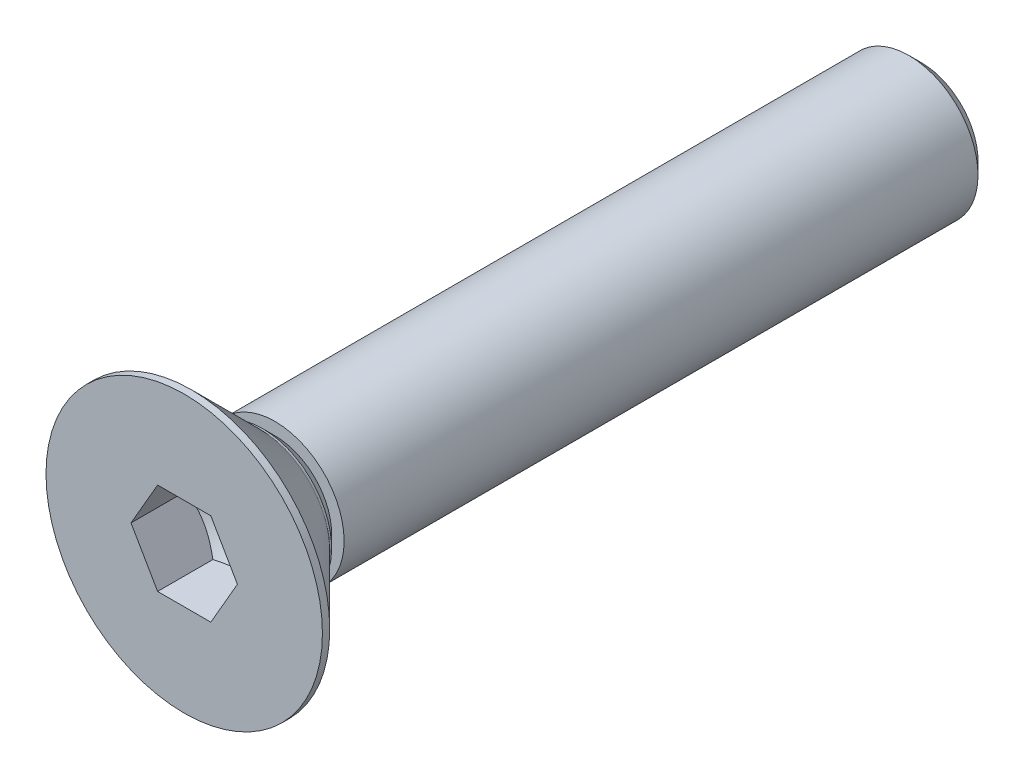
ISO-10303-21;
HEADER;
FILE_DESCRIPTION(('STEP AP214'),'2;1');
FILE_NAME('part.step','',(''),(''),'','','');
FILE_SCHEMA(('AUTOMOTIVE_DESIGN { 1 0 10303 214 1 1 1 1 }'));
ENDSEC;
DATA;
#1=APPLICATION_CONTEXT('core data for automotive mechanical design processes');
#2=APPLICATION_PROTOCOL_DEFINITION('international standard','automotive_design',2000,#1);
#3=PRODUCT_CONTEXT('',#1,'mechanical');
#4=PRODUCT('Part','Part','',(#3));
#5=PRODUCT_RELATED_PRODUCT_CATEGORY('part','',(#4));
#6=PRODUCT_DEFINITION_FORMATION('','',#4);
#7=PRODUCT_DEFINITION_CONTEXT('part definition',#1,'design');
#8=PRODUCT_DEFINITION('design','',#6,#7);
#9=PRODUCT_DEFINITION_SHAPE('','',#8);
#10=(LENGTH_UNIT() NAMED_UNIT(*) SI_UNIT(.MILLI.,.METRE.));
#11=(NAMED_UNIT(*) PLANE_ANGLE_UNIT() SI_UNIT($,.RADIAN.));
#12=(NAMED_UNIT(*) SI_UNIT($,.STERADIAN.) SOLID_ANGLE_UNIT());
#13=UNCERTAINTY_MEASURE_WITH_UNIT(LENGTH_MEASURE(1.E-05),#10,'distance_accuracy_value','');
#14=(GEOMETRIC_REPRESENTATION_CONTEXT(3) GLOBAL_UNCERTAINTY_ASSIGNED_CONTEXT((#13)) GLOBAL_UNIT_ASSIGNED_CONTEXT((#10,
#11,#12)) REPRESENTATION_CONTEXT('',''));
#15=CARTESIAN_POINT('',(0.,0.,0.));
#16=DIRECTION('',(0.,0.,1.));
#17=DIRECTION('',(1.,0.,0.));
#18=AXIS2_PLACEMENT_3D('',#15,#16,#17);
#19=CARTESIAN_POINT('',(0.,0.6146875,-16.));
#20=DIRECTION('',(0.,0.,-1.));
#21=DIRECTION('',(0.,1.,0.));
#22=AXIS2_PLACEMENT_3D('',#19,#20,#21);
#23=PLANE('',#22);
#24=CARTESIAN_POINT('',(0.,0.,-16.));
#25=DIRECTION('',(0.,0.,-1.));
#26=DIRECTION('',(0.,1.,0.));
#27=AXIS2_PLACEMENT_3D('',#24,#25,#26);
#28=CIRCLE('',#27,1.229375);
#29=CARTESIAN_POINT('',(0.,1.229375,-16.));
#30=VERTEX_POINT('',#29);
#31=EDGE_CURVE('E9',#30,#30,#28,.T.);
#32=ORIENTED_EDGE('',*,*,#31,.T.);
#33=EDGE_LOOP('',(#32));
#34=FACE_BOUND('',#33,.T.);
#35=ADVANCED_FACE('F15',(#34),#23,.T.);
#36=CARTESIAN_POINT('',(0.,0.,-15.8646875));
#37=DIRECTION('',(0.,0.,1.));
#38=DIRECTION('',(0.,1.,0.));
#39=AXIS2_PLACEMENT_3D('',#36,#37,#38);
#40=CONICAL_SURFACE('',#39,1.3646875,0.78539816339745);
#41=CARTESIAN_POINT('',(0.,0.,-15.729375));
#42=DIRECTION('',(0.,0.,-1.));
#43=DIRECTION('',(0.,1.,0.));
#44=AXIS2_PLACEMENT_3D('',#41,#42,#43);
#45=CIRCLE('',#44,1.5);
#46=CARTESIAN_POINT('',(0.,1.5,-15.729375));
#47=VERTEX_POINT('',#46);
#48=EDGE_CURVE('E25',#47,#47,#45,.T.);
#49=ORIENTED_EDGE('',*,*,#48,.T.);
#50=EDGE_LOOP('',(#49));
#51=FACE_BOUND('',#50,.T.);
#52=ORIENTED_EDGE('',*,*,#31,.F.);
#53=EDGE_LOOP('',(#52));
#54=FACE_BOUND('',#53,.T.);
#55=ADVANCED_FACE('F17',(#51,#54),#40,.T.);
#56=CARTESIAN_POINT('',(0.,0.,-8.7646875));
#57=DIRECTION('',(0.,0.,1.));
#58=DIRECTION('',(0.,1.,0.));
#59=AXIS2_PLACEMENT_3D('',#56,#57,#58);
#60=CYLINDRICAL_SURFACE('',#59,1.5);
#61=ORIENTED_EDGE('',*,*,#48,.F.);
#62=EDGE_LOOP('',(#61));
#63=FACE_BOUND('',#62,.T.);
#64=CARTESIAN_POINT('',(0.,0.,-1.970625));
#65=DIRECTION('',(0.,0.,-1.));
#66=DIRECTION('',(0.,1.,0.));
#67=AXIS2_PLACEMENT_3D('',#64,#65,#66);
#68=CIRCLE('',#67,1.5);
#69=CARTESIAN_POINT('',(0.,-1.5,-1.970625));
#70=VERTEX_POINT('',#69);
#71=EDGE_CURVE('E144',#70,#70,#68,.T.);
#72=ORIENTED_EDGE('',*,*,#71,.T.);
#73=EDGE_LOOP('',(#72));
#74=FACE_BOUND('',#73,.T.);
#75=ADVANCED_FACE('F193',(#63,#74),#60,.T.);
#76=CARTESIAN_POINT('',(0.,0.,-1.7));
#77=DIRECTION('',(0.,0.,-1.));
#78=DIRECTION('',(-1.,0.,0.));
#79=AXIS2_PLACEMENT_3D('',#76,#77,#78);
#80=TOROIDAL_SURFACE('',#79,1.6,0.1);
#81=CARTESIAN_POINT('',(0.,0.,-1.62928932188134));
#82=DIRECTION('',(0.,0.,-1.));
#83=DIRECTION('',(0.,1.,0.));
#84=AXIS2_PLACEMENT_3D('',#81,#82,#83);
#85=CIRCLE('',#84,1.52928932188135);
#86=CARTESIAN_POINT('',(0.,1.52928932188135,-1.62928932188134));
#87=VERTEX_POINT('',#86);
#88=EDGE_CURVE('E173',#87,#87,#85,.T.);
#89=ORIENTED_EDGE('',*,*,#88,.T.);
#90=EDGE_LOOP('',(#89));
#91=FACE_BOUND('',#90,.T.);
#92=CARTESIAN_POINT('',(0.,0.,-1.7));
#93=DIRECTION('',(0.,0.,-1.));
#94=DIRECTION('',(0.,1.,0.));
#95=AXIS2_PLACEMENT_3D('',#92,#93,#94);
#96=CIRCLE('',#95,1.5);
#97=CARTESIAN_POINT('',(0.,1.5,-1.7));
#98=VERTEX_POINT('',#97);
#99=EDGE_CURVE('E102',#98,#98,#96,.T.);
#100=ORIENTED_EDGE('',*,*,#99,.F.);
#101=EDGE_LOOP('',(#100));
#102=FACE_BOUND('',#101,.T.);
#103=ADVANCED_FACE('F196',(#91,#102),#80,.F.);
#104=CARTESIAN_POINT('',(0.,0.,-0.893933982822018));
#105=DIRECTION('',(0.,0.,1.));
#106=DIRECTION('',(0.,1.,0.));
#107=AXIS2_PLACEMENT_3D('',#104,#105,#106);
#108=CONICAL_SURFACE('',#107,2.26464466094068,0.785398163397448);
#109=CARTESIAN_POINT('',(0.,0.,-0.158578643762691));
#110=DIRECTION('',(0.,0.,-1.));
#111=DIRECTION('',(0.,1.,0.));
#112=AXIS2_PLACEMENT_3D('',#109,#110,#111);
#113=CIRCLE('',#112,3.);
#114=CARTESIAN_POINT('',(0.,3.,-0.15857864376269));
#115=VERTEX_POINT('',#114);
#116=EDGE_CURVE('E169',#115,#115,#113,.T.);
#117=ORIENTED_EDGE('',*,*,#116,.T.);
#118=EDGE_LOOP('',(#117));
#119=FACE_BOUND('',#118,.T.);
#120=ORIENTED_EDGE('',*,*,#88,.F.);
#121=EDGE_LOOP('',(#120));
#122=FACE_BOUND('',#121,.T.);
#123=ADVANCED_FACE('F237',(#119,#122),#108,.T.);
#124=CARTESIAN_POINT('',(0.,0.,-0.0792893218813458));
#125=DIRECTION('',(0.,0.,1.));
#126=DIRECTION('',(0.,1.,0.));
#127=AXIS2_PLACEMENT_3D('',#124,#125,#126);
#128=CYLINDRICAL_SURFACE('',#127,3.);
#129=CARTESIAN_POINT('',(0.,0.,0.));
#130=DIRECTION('',(0.,0.,-1.));
#131=DIRECTION('',(0.,1.,0.));
#132=AXIS2_PLACEMENT_3D('',#129,#130,#131);
#133=CIRCLE('',#132,3.);
#134=CARTESIAN_POINT('',(0.,3.,0.));
#135=VERTEX_POINT('',#134);
#136=EDGE_CURVE('E142',#135,#135,#133,.T.);
#137=ORIENTED_EDGE('',*,*,#136,.T.);
#138=EDGE_LOOP('',(#137));
#139=FACE_BOUND('',#138,.T.);
#140=ORIENTED_EDGE('',*,*,#116,.F.);
#141=EDGE_LOOP('',(#140));
#142=FACE_BOUND('',#141,.T.);
#143=ADVANCED_FACE('F226',(#139,#142),#128,.T.);
#144=CARTESIAN_POINT('',(0.,1.5,0.));
#145=DIRECTION('',(0.,0.,1.));
#146=DIRECTION('',(0.,-1.,0.));
#147=AXIS2_PLACEMENT_3D('',#144,#145,#146);
#148=PLANE('',#147);
#149=ORIENTED_EDGE('',*,*,#136,.F.);
#150=EDGE_LOOP('',(#149));
#151=FACE_BOUND('',#150,.T.);
#152=DIRECTION('',(-0.5,0.866025403784439,0.));
#153=VECTOR('',#152,1.);
#154=CARTESIAN_POINT('',(-1.19078452641916,0.062500233125054,0.));
#155=LINE('',#154,#153);
#156=CARTESIAN_POINT('',(-0.57735,-0.999999533749891,0.));
#157=VERTEX_POINT('',#156);
#158=CARTESIAN_POINT('',(-1.1547,0.,0.));
#159=VERTEX_POINT('',#158);
#160=EDGE_CURVE('E147',#157,#159,#155,.T.);
#161=ORIENTED_EDGE('',*,*,#160,.T.);
#162=DIRECTION('',(0.5,0.866025403784439,0.));
#163=VECTOR('',#162,1.);
#164=CARTESIAN_POINT('',(-0.541265473580836,1.06249976687495,0.));
#165=LINE('',#164,#163);
#166=CARTESIAN_POINT('',(-0.57735,0.999999533749891,0.));
#167=VERTEX_POINT('',#166);
#168=EDGE_CURVE('E139',#159,#167,#165,.T.);
#169=ORIENTED_EDGE('',*,*,#168,.T.);
#170=DIRECTION('',(1.,0.,0.));
#171=VECTOR('',#170,1.);
#172=CARTESIAN_POINT('',(0.,0.999999533749891,0.));
#173=LINE('',#172,#171);
#174=CARTESIAN_POINT('',(0.57735,0.999999533749891,0.));
#175=VERTEX_POINT('',#174);
#176=EDGE_CURVE('E151',#167,#175,#173,.T.);
#177=ORIENTED_EDGE('',*,*,#176,.T.);
#178=DIRECTION('',(0.5,-0.866025403784439,0.));
#179=VECTOR('',#178,1.);
#180=CARTESIAN_POINT('',(0.541265473580836,1.06249976687495,0.));
#181=LINE('',#180,#179);
#182=CARTESIAN_POINT('',(1.1547,0.,0.));
#183=VERTEX_POINT('',#182);
#184=EDGE_CURVE('E98',#175,#183,#181,.T.);
#185=ORIENTED_EDGE('',*,*,#184,.T.);
#186=DIRECTION('',(-0.5,-0.866025403784439,0.));
#187=VECTOR('',#186,1.);
#188=CARTESIAN_POINT('',(1.19078452641916,0.0625002331250542,0.));
#189=LINE('',#188,#187);
#190=CARTESIAN_POINT('',(0.57735,-0.999999533749891,0.));
#191=VERTEX_POINT('',#190);
#192=EDGE_CURVE('E133',#183,#191,#189,.T.);
#193=ORIENTED_EDGE('',*,*,#192,.T.);
#194=DIRECTION('',(-1.,0.,0.));
#195=VECTOR('',#194,1.);
#196=CARTESIAN_POINT('',(0.,-0.999999533749891,0.));
#197=LINE('',#196,#195);
#198=EDGE_CURVE('E109',#191,#157,#197,.T.);
#199=ORIENTED_EDGE('',*,*,#198,.T.);
#200=EDGE_LOOP('',(#161,#169,#177,#185,#193,#199));
#201=FACE_BOUND('',#200,.T.);
#202=ADVANCED_FACE('F222',(#151,#201),#148,.T.);
#203=CARTESIAN_POINT('',(-0.866025,0.499999766874945,1.));
#204=DIRECTION('',(-0.866025403784439,0.5,0.));
#205=DIRECTION('',(0.5,0.866025403784439,0.));
#206=AXIS2_PLACEMENT_3D('',#203,#204,#205);
#207=PLANE('',#206);
#208=ORIENTED_EDGE('',*,*,#168,.F.);
#209=DIRECTION('',(0.,0.,-1.));
#210=VECTOR('',#209,1.);
#211=CARTESIAN_POINT('',(-1.1547,0.,1.));
#212=LINE('',#211,#210);
#213=CARTESIAN_POINT('',(-1.1547,0.,-1.2));
#214=VERTEX_POINT('',#213);
#215=EDGE_CURVE('E149',#159,#214,#212,.T.);
#216=ORIENTED_EDGE('',*,*,#215,.T.);
#217=CARTESIAN_POINT('',(-1.1547,0.,-1.2));
#218=CARTESIAN_POINT('',(-0.866025000000001,0.499999766874945,-1.36666658895832));
#219=CARTESIAN_POINT('',(-0.57735,0.999999533749891,-1.2));
#220=(BOUNDED_CURVE() B_SPLINE_CURVE(2,(#217,#218,#219),.UNSPECIFIED.,.F.,
.F.) B_SPLINE_CURVE_WITH_KNOTS((3,3),(0.,1.16843559329444),
.UNSPECIFIED.) CURVE() GEOMETRIC_REPRESENTATION_ITEM() RATIONAL_B_SPLINE_CURVE((1.,
1.15470053837925,1.)) REPRESENTATION_ITEM(''));
#221=CARTESIAN_POINT('',(-0.57735,0.999999533749891,-1.2));
#222=VERTEX_POINT('',#221);
#223=EDGE_CURVE('E116',#214,#222,#220,.T.);
#224=ORIENTED_EDGE('',*,*,#223,.T.);
#225=DIRECTION('',(0.,0.,-1.));
#226=VECTOR('',#225,1.);
#227=CARTESIAN_POINT('',(-0.57735,0.999999533749891,1.));
#228=LINE('',#227,#226);
#229=EDGE_CURVE('E143',#167,#222,#228,.T.);
#230=ORIENTED_EDGE('',*,*,#229,.F.);
#231=EDGE_LOOP('',(#208,#216,#224,#230));
#232=FACE_BOUND('',#231,.T.);
#233=ADVANCED_FACE('F225',(#232),#207,.F.);
#234=CARTESIAN_POINT('',(0.,0.999999533749891,1.));
#235=DIRECTION('',(0.,1.,0.));
#236=DIRECTION('',(1.,0.,0.));
#237=AXIS2_PLACEMENT_3D('',#234,#235,#236);
#238=PLANE('',#237);
#239=ORIENTED_EDGE('',*,*,#176,.F.);
#240=ORIENTED_EDGE('',*,*,#229,.T.);
#241=CARTESIAN_POINT('',(-0.57735,0.999999533749891,-1.2));
#242=CARTESIAN_POINT('',(0.,0.999999533749893,-1.36666658895832));
#243=CARTESIAN_POINT('',(0.57735,0.999999533749891,-1.2));
#244=(BOUNDED_CURVE() B_SPLINE_CURVE(2,(#241,#242,#243),.UNSPECIFIED.,.F.,
.F.) B_SPLINE_CURVE_WITH_KNOTS((3,3),(0.,1.16843559329444),
.UNSPECIFIED.) CURVE() GEOMETRIC_REPRESENTATION_ITEM() RATIONAL_B_SPLINE_CURVE((1.,
1.15470053837925,1.)) REPRESENTATION_ITEM(''));
#245=CARTESIAN_POINT('',(0.57735,0.999999533749891,-1.2));
#246=VERTEX_POINT('',#245);
#247=EDGE_CURVE('E85',#222,#246,#244,.T.);
#248=ORIENTED_EDGE('',*,*,#247,.T.);
#249=DIRECTION('',(0.,0.,-1.));
#250=VECTOR('',#249,1.);
#251=CARTESIAN_POINT('',(0.57735,0.999999533749891,1.));
#252=LINE('',#251,#250);
#253=EDGE_CURVE('E92',#175,#246,#252,.T.);
#254=ORIENTED_EDGE('',*,*,#253,.F.);
#255=EDGE_LOOP('',(#239,#240,#248,#254));
#256=FACE_BOUND('',#255,.T.);
#257=ADVANCED_FACE('F233',(#256),#238,.F.);
#258=CARTESIAN_POINT('',(-0.866025,-0.499999766874946,1.));
#259=DIRECTION('',(-0.866025403784439,-0.5,0.));
#260=DIRECTION('',(-0.5,0.866025403784439,0.));
#261=AXIS2_PLACEMENT_3D('',#258,#259,#260);
#262=PLANE('',#261);
#263=ORIENTED_EDGE('',*,*,#160,.F.);
#264=DIRECTION('',(0.,0.,-1.));
#265=VECTOR('',#264,1.);
#266=CARTESIAN_POINT('',(-0.57735,-0.999999533749891,1.));
#267=LINE('',#266,#265);
#268=CARTESIAN_POINT('',(-0.57735,-0.999999533749892,-1.2));
#269=VERTEX_POINT('',#268);
#270=EDGE_CURVE('E113',#157,#269,#267,.T.);
#271=ORIENTED_EDGE('',*,*,#270,.T.);
#272=CARTESIAN_POINT('',(-0.57735,-0.999999533749891,-1.2));
#273=CARTESIAN_POINT('',(-0.866025,-0.499999766874945,-1.36666658895832));
#274=CARTESIAN_POINT('',(-1.1547,0.,-1.2));
#275=(BOUNDED_CURVE() B_SPLINE_CURVE(2,(#272,#273,#274),.UNSPECIFIED.,.F.,
.F.) B_SPLINE_CURVE_WITH_KNOTS((3,3),(0.,1.16843559329444),
.UNSPECIFIED.) CURVE() GEOMETRIC_REPRESENTATION_ITEM() RATIONAL_B_SPLINE_CURVE((1.,
1.15470053837925,1.)) REPRESENTATION_ITEM(''));
#276=EDGE_CURVE('E120',#269,#214,#275,.T.);
#277=ORIENTED_EDGE('',*,*,#276,.T.);
#278=ORIENTED_EDGE('',*,*,#215,.F.);
#279=EDGE_LOOP('',(#263,#271,#277,#278));
#280=FACE_BOUND('',#279,.T.);
#281=ADVANCED_FACE('F75',(#280),#262,.F.);
#282=CARTESIAN_POINT('',(0.,0.,-1.53333317791663));
#283=DIRECTION('',(0.,0.,1.));
#284=DIRECTION('',(0.,1.,0.));
#285=AXIS2_PLACEMENT_3D('',#282,#283,#284);
#286=CONICAL_SURFACE('',#285,0.57735,1.0471975511966);
#287=CARTESIAN_POINT('',(0.,0.,-1.86666635583326));
#288=VERTEX_POINT('',#287);
#289=VERTEX_LOOP('',#288);
#290=FACE_BOUND('',#289,.T.);
#291=CARTESIAN_POINT('',(0.57735,0.999999533749891,-1.2));
#292=CARTESIAN_POINT('',(0.866025000000001,0.499999766874945,-1.36666658895832));
#293=CARTESIAN_POINT('',(1.1547,0.,-1.2));
#294=(BOUNDED_CURVE() B_SPLINE_CURVE(2,(#291,#292,#293),.UNSPECIFIED.,.F.,
.F.) B_SPLINE_CURVE_WITH_KNOTS((3,3),(0.,1.16843559329444),
.UNSPECIFIED.) CURVE() GEOMETRIC_REPRESENTATION_ITEM() RATIONAL_B_SPLINE_CURVE((1.,
1.15470053837925,1.)) REPRESENTATION_ITEM(''));
#295=CARTESIAN_POINT('',(1.1547,0.,-1.2));
#296=VERTEX_POINT('',#295);
#297=EDGE_CURVE('E81',#246,#296,#294,.T.);
#298=ORIENTED_EDGE('',*,*,#297,.F.);
#299=ORIENTED_EDGE('',*,*,#247,.F.);
#300=ORIENTED_EDGE('',*,*,#223,.F.);
#301=ORIENTED_EDGE('',*,*,#276,.F.);
#302=CARTESIAN_POINT('',(0.57735,-0.999999533749891,-1.2));
#303=CARTESIAN_POINT('',(0.,-0.999999533749893,-1.36666658895832));
#304=CARTESIAN_POINT('',(-0.57735,-0.999999533749891,-1.2));
#305=(BOUNDED_CURVE() B_SPLINE_CURVE(2,(#302,#303,#304),.UNSPECIFIED.,.F.,
.F.) B_SPLINE_CURVE_WITH_KNOTS((3,3),(0.,1.16843559329444),
.UNSPECIFIED.) CURVE() GEOMETRIC_REPRESENTATION_ITEM() RATIONAL_B_SPLINE_CURVE((1.,
1.15470053837925,1.)) REPRESENTATION_ITEM(''));
#306=CARTESIAN_POINT('',(0.57735,-0.999999533749891,-1.2));
#307=VERTEX_POINT('',#306);
#308=EDGE_CURVE('E111',#307,#269,#305,.T.);
#309=ORIENTED_EDGE('',*,*,#308,.F.);
#310=CARTESIAN_POINT('',(1.1547,0.,-1.2));
#311=CARTESIAN_POINT('',(0.866025000000001,-0.499999766874945,-1.36666658895832));
#312=CARTESIAN_POINT('',(0.57735,-0.999999533749891,-1.2));
#313=(BOUNDED_CURVE() B_SPLINE_CURVE(2,(#310,#311,#312),.UNSPECIFIED.,.F.,
.F.) B_SPLINE_CURVE_WITH_KNOTS((3,3),(0.,1.16843559329444),
.UNSPECIFIED.) CURVE() GEOMETRIC_REPRESENTATION_ITEM() RATIONAL_B_SPLINE_CURVE((1.,
1.15470053837925,1.)) REPRESENTATION_ITEM(''));
#314=EDGE_CURVE('E87',#296,#307,#313,.T.);
#315=ORIENTED_EDGE('',*,*,#314,.F.);
#316=EDGE_LOOP('',(#298,#299,#300,#301,#309,#315));
#317=FACE_BOUND('',#316,.T.);
#318=ADVANCED_FACE('F71',(#290,#317),#286,.F.);
#319=CARTESIAN_POINT('',(0.,-0.999999533749891,1.));
#320=DIRECTION('',(0.,-1.,0.));
#321=DIRECTION('',(-1.,0.,0.));
#322=AXIS2_PLACEMENT_3D('',#319,#320,#321);
#323=PLANE('',#322);
#324=ORIENTED_EDGE('',*,*,#198,.F.);
#325=DIRECTION('',(0.,0.,-1.));
#326=VECTOR('',#325,1.);
#327=CARTESIAN_POINT('',(0.57735,-0.999999533749891,1.));
#328=LINE('',#327,#326);
#329=EDGE_CURVE('E106',#191,#307,#328,.T.);
#330=ORIENTED_EDGE('',*,*,#329,.T.);
#331=ORIENTED_EDGE('',*,*,#308,.T.);
#332=ORIENTED_EDGE('',*,*,#270,.F.);
#333=EDGE_LOOP('',(#324,#330,#331,#332));
#334=FACE_BOUND('',#333,.T.);
#335=ADVANCED_FACE('F74',(#334),#323,.F.);
#336=CARTESIAN_POINT('',(0.866025,-0.499999766874946,1.));
#337=DIRECTION('',(0.866025403784439,-0.5,0.));
#338=DIRECTION('',(-0.5,-0.866025403784439,0.));
#339=AXIS2_PLACEMENT_3D('',#336,#337,#338);
#340=PLANE('',#339);
#341=ORIENTED_EDGE('',*,*,#192,.F.);
#342=DIRECTION('',(0.,0.,-1.));
#343=VECTOR('',#342,1.);
#344=CARTESIAN_POINT('',(1.1547,0.,1.));
#345=LINE('',#344,#343);
#346=EDGE_CURVE('E19',#183,#296,#345,.T.);
#347=ORIENTED_EDGE('',*,*,#346,.T.);
#348=ORIENTED_EDGE('',*,*,#314,.T.);
#349=ORIENTED_EDGE('',*,*,#329,.F.);
#350=EDGE_LOOP('',(#341,#347,#348,#349));
#351=FACE_BOUND('',#350,.T.);
#352=ADVANCED_FACE('F220',(#351),#340,.F.);
#353=CARTESIAN_POINT('',(0.866025,0.499999766874946,1.));
#354=DIRECTION('',(0.866025403784439,0.5,0.));
#355=DIRECTION('',(0.5,-0.866025403784439,0.));
#356=AXIS2_PLACEMENT_3D('',#353,#354,#355);
#357=PLANE('',#356);
#358=ORIENTED_EDGE('',*,*,#184,.F.);
#359=ORIENTED_EDGE('',*,*,#253,.T.);
#360=ORIENTED_EDGE('',*,*,#297,.T.);
#361=ORIENTED_EDGE('',*,*,#346,.F.);
#362=EDGE_LOOP('',(#358,#359,#360,#361));
#363=FACE_BOUND('',#362,.T.);
#364=ADVANCED_FACE('F96',(#363),#357,.F.);
#365=CARTESIAN_POINT('',(0.,0.,-1.8353125));
#366=DIRECTION('',(0.,0.,1.));
#367=DIRECTION('',(0.,1.,0.));
#368=AXIS2_PLACEMENT_3D('',#365,#366,#367);
#369=CONICAL_SURFACE('',#368,1.3646875,0.785398163397448);
#370=CARTESIAN_POINT('',(0.,0.,-1.970625));
#371=DIRECTION('',(0.,0.,-1.));
#372=DIRECTION('',(0.,1.,0.));
#373=AXIS2_PLACEMENT_3D('',#370,#371,#372);
#374=CIRCLE('',#373,1.229375);
#375=CARTESIAN_POINT('',(0.,1.229375,-1.970625));
#376=VERTEX_POINT('',#375);
#377=EDGE_CURVE('E138',#376,#376,#374,.T.);
#378=ORIENTED_EDGE('',*,*,#377,.F.);
#379=EDGE_LOOP('',(#378));
#380=FACE_BOUND('',#379,.T.);
#381=ORIENTED_EDGE('',*,*,#99,.T.);
#382=EDGE_LOOP('',(#381));
#383=FACE_BOUND('',#382,.T.);
#384=ADVANCED_FACE('F202',(#380,#383),#369,.T.);
#385=CARTESIAN_POINT('',(0.,1.8646875,-1.970625));
#386=DIRECTION('',(0.,0.,-1.));
#387=DIRECTION('',(0.,1.,0.));
#388=AXIS2_PLACEMENT_3D('',#385,#386,#387);
#389=PLANE('',#388);
#390=ORIENTED_EDGE('',*,*,#377,.T.);
#391=EDGE_LOOP('',(#390));
#392=FACE_BOUND('',#391,.T.);
#393=ORIENTED_EDGE('',*,*,#71,.F.);
#394=EDGE_LOOP('',(#393));
#395=FACE_BOUND('',#394,.T.);
#396=ADVANCED_FACE('F200',(#392,#395),#389,.F.);
#397=CLOSED_SHELL('',(#35,#55,#75,#103,#123,#143,#202,#233,#257,#281,#318,#335,#352,#364,#384,#396));
#398=MANIFOLD_SOLID_BREP('B1',#397);
#399=ADVANCED_BREP_SHAPE_REPRESENTATION('',(#18,#398),#14);
#400=SHAPE_DEFINITION_REPRESENTATION(#9,#399);
ENDSEC;
END-ISO-10303-21;
